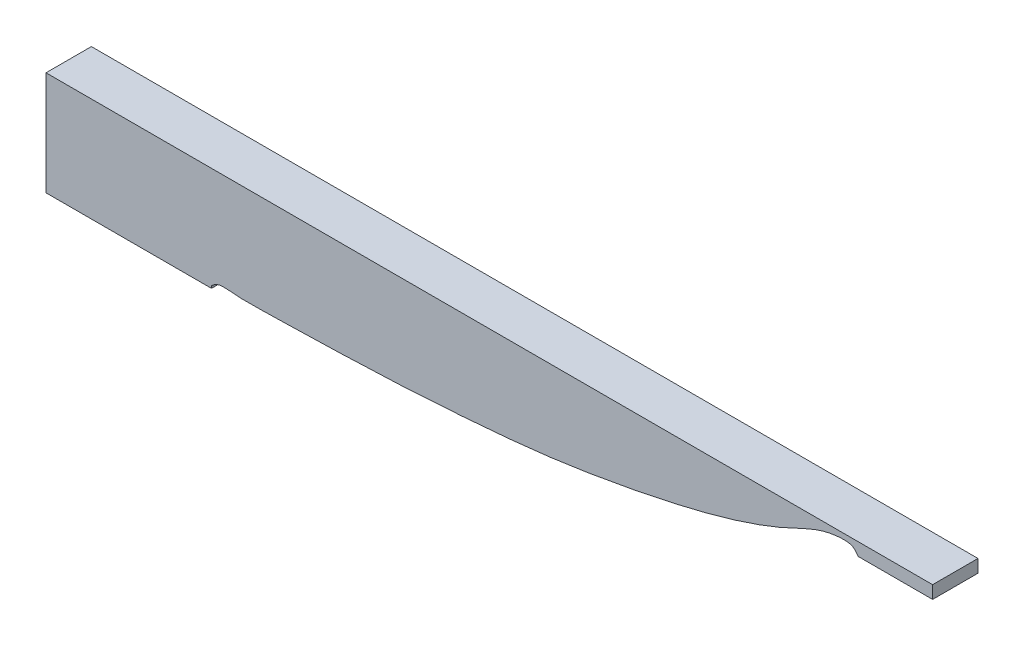
ISO-10303-21;
HEADER;
FILE_DESCRIPTION(('STEP AP214'),'2;1');
FILE_NAME('part.step','',(''),(''),'','','');
FILE_SCHEMA(('AUTOMOTIVE_DESIGN { 1 0 10303 214 1 1 1 1 }'));
ENDSEC;
DATA;
#1=APPLICATION_CONTEXT('core data for automotive mechanical design processes');
#2=APPLICATION_PROTOCOL_DEFINITION('international standard','automotive_design',2000,#1);
#3=PRODUCT_CONTEXT('',#1,'mechanical');
#4=PRODUCT('Part','Part','',(#3));
#5=PRODUCT_RELATED_PRODUCT_CATEGORY('part','',(#4));
#6=PRODUCT_DEFINITION_FORMATION('','',#4);
#7=PRODUCT_DEFINITION_CONTEXT('part definition',#1,'design');
#8=PRODUCT_DEFINITION('design','',#6,#7);
#9=PRODUCT_DEFINITION_SHAPE('','',#8);
#10=(LENGTH_UNIT() NAMED_UNIT(*) SI_UNIT(.MILLI.,.METRE.));
#11=(NAMED_UNIT(*) PLANE_ANGLE_UNIT() SI_UNIT($,.RADIAN.));
#12=(NAMED_UNIT(*) SI_UNIT($,.STERADIAN.) SOLID_ANGLE_UNIT());
#13=UNCERTAINTY_MEASURE_WITH_UNIT(LENGTH_MEASURE(1.E-05),#10,'distance_accuracy_value','');
#14=(GEOMETRIC_REPRESENTATION_CONTEXT(3) GLOBAL_UNCERTAINTY_ASSIGNED_CONTEXT((#13)) GLOBAL_UNIT_ASSIGNED_CONTEXT((#10,
#11,#12)) REPRESENTATION_CONTEXT('',''));
#15=CARTESIAN_POINT('',(0.,0.,0.));
#16=DIRECTION('',(0.,0.,1.));
#17=DIRECTION('',(1.,0.,0.));
#18=AXIS2_PLACEMENT_3D('',#15,#16,#17);
#19=CARTESIAN_POINT('',(-87.4894542831394,-16.0709596343908,428.));
#20=DIRECTION('',(-2.10516775839244E-06,0.999999999997784,0.));
#21=DIRECTION('',(-0.999999999997784,-2.10516775839244E-06,0.));
#22=AXIS2_PLACEMENT_3D('',#19,#20,#21);
#23=PLANE('',#22);
#24=DIRECTION('',(0.999999999997784,2.10516775839244E-06,0.));
#25=VECTOR('',#24,1.);
#26=CARTESIAN_POINT('',(-87.4894542831394,-16.0709596343908,420.));
#27=LINE('',#26,#25);
#28=CARTESIAN_POINT('',(-87.4894542831394,-16.0709596343908,420.));
#29=VERTEX_POINT('',#28);
#30=CARTESIAN_POINT('',(-58.3255403885278,-16.0708982394595,420.));
#31=VERTEX_POINT('',#30);
#32=EDGE_CURVE('E151',#29,#31,#27,.T.);
#33=ORIENTED_EDGE('',*,*,#32,.T.);
#34=DIRECTION('',(0.,0.,-1.));
#35=VECTOR('',#34,1.);
#36=CARTESIAN_POINT('',(-58.3255403885278,-16.0708982394595,428.));
#37=LINE('',#36,#35);
#38=CARTESIAN_POINT('',(-58.3255403885278,-16.0708982394595,428.));
#39=VERTEX_POINT('',#38);
#40=EDGE_CURVE('E11',#39,#31,#37,.T.);
#41=ORIENTED_EDGE('',*,*,#40,.F.);
#42=DIRECTION('',(0.999999999997784,2.10516775839244E-06,0.));
#43=VECTOR('',#42,1.);
#44=CARTESIAN_POINT('',(-87.4894542831394,-16.0709596343908,428.));
#45=LINE('',#44,#43);
#46=CARTESIAN_POINT('',(-87.4894542831394,-16.0709596343908,428.));
#47=VERTEX_POINT('',#46);
#48=EDGE_CURVE('E121',#47,#39,#45,.T.);
#49=ORIENTED_EDGE('',*,*,#48,.F.);
#50=DIRECTION('',(0.,0.,-1.));
#51=VECTOR('',#50,1.);
#52=CARTESIAN_POINT('',(-87.4894542831394,-16.0709596343908,428.));
#53=LINE('',#52,#51);
#54=EDGE_CURVE('E113',#47,#29,#53,.T.);
#55=ORIENTED_EDGE('',*,*,#54,.T.);
#56=EDGE_LOOP('',(#33,#41,#49,#55));
#57=FACE_BOUND('',#56,.T.);
#58=ADVANCED_FACE('F30',(#57),#23,.F.);
#59=CARTESIAN_POINT('',(-58.3255403885278,-16.0708982394595,428.));
#60=CARTESIAN_POINT('',(-58.3349945008703,-15.994079958224,428.));
#61=CARTESIAN_POINT('',(-58.3430996185986,-15.9155735939327,428.));
#62=CARTESIAN_POINT('',(-58.3263400943751,-15.7606406914637,428.));
#63=CARTESIAN_POINT('',(-58.3015582502265,-15.6843366767705,428.));
#64=CARTESIAN_POINT('',(-58.221198639925,-15.5517101154156,428.));
#65=CARTESIAN_POINT('',(-58.1629225494414,-15.4970308604943,428.));
#66=CARTESIAN_POINT('',(-58.0407921632544,-15.4050555278782,428.));
#67=CARTESIAN_POINT('',(-57.9775376150464,-15.3622181954311,428.));
#68=CARTESIAN_POINT('',(-57.7882476082578,-15.2330246652949,428.));
#69=CARTESIAN_POINT('',(-57.6573970115861,-15.1522569878723,428.));
#70=CARTESIAN_POINT('',(-57.3854637739449,-15.0116029227251,428.));
#71=CARTESIAN_POINT('',(-57.2447698982695,-14.9545835574969,428.));
#72=CARTESIAN_POINT('',(-56.9523823800674,-14.8715101929236,428.));
#73=CARTESIAN_POINT('',(-56.8002380245661,-14.8439752576486,428.));
#74=CARTESIAN_POINT('',(-56.497540480807,-14.8092799248791,428.));
#75=CARTESIAN_POINT('',(-56.345997900637,-14.8016448283076,428.));
#76=CARTESIAN_POINT('',(-55.8910348877392,-14.7955414848149,428.));
#77=CARTESIAN_POINT('',(-55.5872095119741,-14.8121250965454,428.));
#78=CARTESIAN_POINT('',(-54.9797376741491,-14.859540366615,428.));
#79=CARTESIAN_POINT('',(-54.6763438263725,-14.8904292500324,428.));
#80=CARTESIAN_POINT('',(-54.0689610457127,-14.93971413597,428.));
#81=CARTESIAN_POINT('',(-53.7650057217789,-14.9588157058092,428.));
#82=CARTESIAN_POINT('',(-52.8524586258942,-15.0018212807062,428.));
#83=CARTESIAN_POINT('',(-52.243148801839,-15.0106509051172,428.));
#84=CARTESIAN_POINT('',(-51.0233957443819,-15.0045159977491,428.));
#85=CARTESIAN_POINT('',(-50.413683374274,-14.9925929645954,428.));
#86=CARTESIAN_POINT('',(-49.1942847772398,-14.9684180581558,428.));
#87=CARTESIAN_POINT('',(-48.5845781267326,-14.9566852218082,428.));
#88=CARTESIAN_POINT('',(-46.7555324376674,-14.9179047275533,428.));
#89=CARTESIAN_POINT('',(-45.5362669172419,-14.887310986256,428.));
#90=CARTESIAN_POINT('',(-41.8784820456503,-14.7949659205474,428.));
#91=CARTESIAN_POINT('',(-39.4400289388297,-14.7303464901799,428.));
#92=CARTESIAN_POINT('',(-34.5635986833189,-14.5850149915789,428.));
#93=CARTESIAN_POINT('',(-32.1256708468318,-14.502897670421,428.));
#94=CARTESIAN_POINT('',(-27.2513382018958,-14.3006183262893,428.));
#95=CARTESIAN_POINT('',(-24.814964692482,-14.1802482106153,428.));
#96=CARTESIAN_POINT('',(-19.9450224759137,-13.8990207319383,428.));
#97=CARTESIAN_POINT('',(-17.5112758603808,-13.7386901222707,428.));
#98=CARTESIAN_POINT('',(-12.6458601928915,-13.3845758248458,428.));
#99=CARTESIAN_POINT('',(-10.2140363742769,-13.1925640461585,428.));
#100=CARTESIAN_POINT('',(-5.35587574845442,-12.7575885545654,428.));
#101=CARTESIAN_POINT('',(-2.92945374601444,-12.513373762498,428.));
#102=CARTESIAN_POINT('',(1.91495725909716,-11.9401575526273,428.));
#103=CARTESIAN_POINT('',(4.33273488245867,-11.6096528672461,428.));
#104=CARTESIAN_POINT('',(9.15239523998222,-10.8634908819737,428.));
#105=CARTESIAN_POINT('',(11.5555170791069,-10.4496694325095,428.));
#106=CARTESIAN_POINT('',(16.3519276015662,-9.56230873743193,428.));
#107=CARTESIAN_POINT('',(18.7451423542686,-9.08770435501141,428.));
#108=CARTESIAN_POINT('',(23.5146150195793,-8.06253442497621,428.));
#109=CARTESIAN_POINT('',(25.8923040265324,-7.5151610193815,428.));
#110=CARTESIAN_POINT('',(29.436552488622,-6.60817433943435,428.));
#111=CARTESIAN_POINT('',(30.6147750259266,-6.2904225308102,428.));
#112=CARTESIAN_POINT('',(32.9581752642637,-5.61669965307409,428.));
#113=CARTESIAN_POINT('',(34.1227795496316,-5.26042838224494,428.));
#114=CARTESIAN_POINT('',(36.4378473236999,-4.50920532821471,428.));
#115=CARTESIAN_POINT('',(37.5885132391884,-4.1148072600599,428.));
#116=CARTESIAN_POINT('',(39.8716268887461,-3.27617739738042,428.));
#117=CARTESIAN_POINT('',(41.0039178497968,-2.83151676841148,428.));
#118=CARTESIAN_POINT('',(42.6811785910618,-2.10660214801663,428.));
#119=CARTESIAN_POINT('',(43.2368433506352,-1.85560303459679,428.));
#120=CARTESIAN_POINT('',(44.3445395591243,-1.34366630703781,428.));
#121=CARTESIAN_POINT('',(44.8960191606172,-1.08119890956309,428.));
#122=CARTESIAN_POINT('',(46.5538033787544,-0.303092262715943,428.));
#123=CARTESIAN_POINT('',(47.6644508083302,0.200375035527951,428.));
#124=CARTESIAN_POINT('',(49.3991963594365,0.763156282351912,428.));
#125=CARTESIAN_POINT('',(49.9893332872162,0.917488174976652,428.));
#126=CARTESIAN_POINT('',(51.1943185326296,1.15701347600094,428.));
#127=CARTESIAN_POINT('',(51.8079485186502,1.24321360329939,428.));
#128=CARTESIAN_POINT('',(52.726500906872,1.30481067499705,428.));
#129=CARTESIAN_POINT('',(53.0332156410314,1.31450136830585,428.));
#130=CARTESIAN_POINT('',(53.4949732156863,1.2945987111883,428.));
#131=CARTESIAN_POINT('',(53.649161351078,1.28246925540658,428.));
#132=CARTESIAN_POINT('',(53.9582050323121,1.24457337626118,428.));
#133=CARTESIAN_POINT('',(54.1110774716984,1.21843119140016,428.));
#134=CARTESIAN_POINT('',(54.4102219996154,1.14057268930917,428.));
#135=CARTESIAN_POINT('',(54.558823927286,1.08721557390386,428.));
#136=CARTESIAN_POINT('',(54.8314730470977,0.939060799854606,428.));
#137=CARTESIAN_POINT('',(54.9521936399689,0.842183423002254,428.));
#138=CARTESIAN_POINT('',(55.1760288322301,0.624120594158259,428.));
#139=CARTESIAN_POINT('',(55.276054447828,0.504603795210752,428.));
#140=CARTESIAN_POINT('',(55.4317214651797,0.330291434711497,428.));
#141=CARTESIAN_POINT('',(55.4838226608845,0.272374406418086,428.));
#142=CARTESIAN_POINT('',(55.5765681192619,0.146438554929085,428.));
#143=CARTESIAN_POINT('',(55.6146311005568,0.0773729202210477,428.));
#144=CARTESIAN_POINT('',(55.6303665751122,0.,428.));
#145=B_SPLINE_CURVE_WITH_KNOTS('',3,(#59,#60,#61,#62,#63,#64,#65,#66,#67,#68,#69,#70,#71,#72,
#73,#74,#75,#76,#77,#78,#79,#80,#81,#82,#83,#84,#85,#86,#87,#88,#89,#90,#91,#92,#93,#94,#95,#96,
#97,#98,#99,#100,#101,#102,#103,#104,#105,#106,#107,#108,#109,#110,#111,#112,#113,#114,#115,
#116,#117,#118,#119,#120,#121,#122,#123,#124,#125,#126,#127,#128,#129,#130,#131,#132,#133,#134,
#135,#136,#137,#138,#139,#140,#141,#142,#143,#144),.UNSPECIFIED.,.F.,.F.,(4,2,2,2,2,2,2,2,2,2,2,
2,2,2,2,2,2,2,2,2,2,2,2,2,2,2,2,2,2,2,2,2,2,2,2,2,2,2,2,2,2,2,4),(0.,0.001953125,
0.00390624999999989,0.00585937499999989,0.00781249999999989,0.0117187499999998,
0.0156249999999997,0.0195312499999996,0.0234374999999996,0.0312499999999996,0.0390624999999997,
0.0468749999999998,0.0624999999999998,0.0781249999999998,0.0937499999999998,0.125,0.1875,
0.249999999999999,0.312499999999999,0.374999999999999,0.437499999999999,0.499999999999999,
0.562499999999999,0.624999999999999,0.687499999999999,0.749999999999999,0.781249999999999,
0.812499999999999,0.843749999999999,0.874999999999999,0.890624999999999,0.906249999999999,
0.9375,0.953125,0.96875,0.9765625,0.98046875,0.984375,0.98828125,0.9921875,0.99609375,
0.998046875,1.),.UNSPECIFIED.);
#146=DIRECTION('',(0.,0.,-1.));
#147=VECTOR('',#146,1.);
#148=SURFACE_OF_LINEAR_EXTRUSION('',#145,#147);
#149=CARTESIAN_POINT('',(-58.3255403885278,-16.0708982394595,420.000000000001));
#150=CARTESIAN_POINT('',(-58.3349945008703,-15.994079958224,420.000000000001));
#151=CARTESIAN_POINT('',(-58.3430996185986,-15.9155735939327,420.000000000001));
#152=CARTESIAN_POINT('',(-58.3263400943751,-15.7606406914637,420.000000000001));
#153=CARTESIAN_POINT('',(-58.3015582502265,-15.6843366767705,420.000000000001));
#154=CARTESIAN_POINT('',(-58.221198639925,-15.5517101154156,420.000000000001));
#155=CARTESIAN_POINT('',(-58.1629225494414,-15.4970308604943,420.000000000001));
#156=CARTESIAN_POINT('',(-58.0407921632544,-15.4050555278782,420.000000000001));
#157=CARTESIAN_POINT('',(-57.9775376150464,-15.3622181954311,420.000000000001));
#158=CARTESIAN_POINT('',(-57.7882476082578,-15.2330246652949,420.000000000001));
#159=CARTESIAN_POINT('',(-57.6573970115861,-15.1522569878723,420.000000000001));
#160=CARTESIAN_POINT('',(-57.3854637739449,-15.0116029227251,420.000000000001));
#161=CARTESIAN_POINT('',(-57.2447698982695,-14.9545835574969,420.000000000001));
#162=CARTESIAN_POINT('',(-56.9523823800674,-14.8715101929236,420.000000000001));
#163=CARTESIAN_POINT('',(-56.8002380245661,-14.8439752576486,420.000000000001));
#164=CARTESIAN_POINT('',(-56.497540480807,-14.8092799248791,420.000000000001));
#165=CARTESIAN_POINT('',(-56.345997900637,-14.8016448283076,420.000000000001));
#166=CARTESIAN_POINT('',(-55.8910348877392,-14.7955414848149,420.000000000001));
#167=CARTESIAN_POINT('',(-55.5872095119741,-14.8121250965454,420.000000000001));
#168=CARTESIAN_POINT('',(-54.9797376741491,-14.859540366615,420.000000000001));
#169=CARTESIAN_POINT('',(-54.6763438263725,-14.8904292500324,420.000000000001));
#170=CARTESIAN_POINT('',(-54.0689610457127,-14.93971413597,420.000000000001));
#171=CARTESIAN_POINT('',(-53.7650057217789,-14.9588157058092,420.000000000001));
#172=CARTESIAN_POINT('',(-52.8524586258942,-15.0018212807062,420.000000000001));
#173=CARTESIAN_POINT('',(-52.243148801839,-15.0106509051172,420.000000000001));
#174=CARTESIAN_POINT('',(-51.0233957443819,-15.0045159977491,420.000000000001));
#175=CARTESIAN_POINT('',(-50.413683374274,-14.9925929645954,420.000000000001));
#176=CARTESIAN_POINT('',(-49.1942847772398,-14.9684180581558,420.000000000001));
#177=CARTESIAN_POINT('',(-48.5845781267326,-14.9566852218082,420.000000000001));
#178=CARTESIAN_POINT('',(-46.7555324376674,-14.9179047275533,420.000000000001));
#179=CARTESIAN_POINT('',(-45.5362669172419,-14.887310986256,420.000000000001));
#180=CARTESIAN_POINT('',(-41.8784820456503,-14.7949659205474,420.000000000001));
#181=CARTESIAN_POINT('',(-39.4400289388297,-14.7303464901799,420.000000000001));
#182=CARTESIAN_POINT('',(-34.5635986833189,-14.5850149915789,420.000000000001));
#183=CARTESIAN_POINT('',(-32.1256708468318,-14.502897670421,420.000000000001));
#184=CARTESIAN_POINT('',(-27.2513382018958,-14.3006183262893,420.000000000001));
#185=CARTESIAN_POINT('',(-24.814964692482,-14.1802482106153,420.000000000001));
#186=CARTESIAN_POINT('',(-19.9450224759137,-13.8990207319383,420.000000000001));
#187=CARTESIAN_POINT('',(-17.5112758603808,-13.7386901222707,420.000000000001));
#188=CARTESIAN_POINT('',(-12.6458601928915,-13.3845758248458,420.000000000001));
#189=CARTESIAN_POINT('',(-10.2140363742769,-13.1925640461585,420.000000000001));
#190=CARTESIAN_POINT('',(-5.35587574845442,-12.7575885545654,420.000000000001));
#191=CARTESIAN_POINT('',(-2.92945374601444,-12.513373762498,420.000000000001));
#192=CARTESIAN_POINT('',(1.91495725909716,-11.9401575526273,420.000000000001));
#193=CARTESIAN_POINT('',(4.33273488245867,-11.6096528672461,420.000000000001));
#194=CARTESIAN_POINT('',(9.15239523998222,-10.8634908819737,420.000000000001));
#195=CARTESIAN_POINT('',(11.5555170791069,-10.4496694325095,420.000000000001));
#196=CARTESIAN_POINT('',(16.3519276015662,-9.56230873743193,420.000000000001));
#197=CARTESIAN_POINT('',(18.7451423542686,-9.08770435501141,420.000000000001));
#198=CARTESIAN_POINT('',(23.5146150195793,-8.06253442497621,420.000000000001));
#199=CARTESIAN_POINT('',(25.8923040265324,-7.5151610193815,420.000000000001));
#200=CARTESIAN_POINT('',(29.436552488622,-6.60817433943435,420.000000000001));
#201=CARTESIAN_POINT('',(30.6147750259266,-6.2904225308102,420.000000000001));
#202=CARTESIAN_POINT('',(32.9581752642637,-5.61669965307409,420.000000000001));
#203=CARTESIAN_POINT('',(34.1227795496316,-5.26042838224494,420.000000000001));
#204=CARTESIAN_POINT('',(36.4378473236999,-4.50920532821471,420.000000000001));
#205=CARTESIAN_POINT('',(37.5885132391884,-4.1148072600599,420.000000000001));
#206=CARTESIAN_POINT('',(39.8716268887461,-3.27617739738042,420.000000000001));
#207=CARTESIAN_POINT('',(41.0039178497968,-2.83151676841148,420.000000000001));
#208=CARTESIAN_POINT('',(42.6811785910618,-2.10660214801663,420.000000000001));
#209=CARTESIAN_POINT('',(43.2368433506352,-1.85560303459679,420.000000000001));
#210=CARTESIAN_POINT('',(44.3445395591243,-1.34366630703781,420.000000000001));
#211=CARTESIAN_POINT('',(44.8960191606172,-1.08119890956309,420.000000000001));
#212=CARTESIAN_POINT('',(46.5538033787544,-0.303092262715943,420.000000000001));
#213=CARTESIAN_POINT('',(47.6644508083302,0.200375035527951,420.000000000001));
#214=CARTESIAN_POINT('',(49.3991963594365,0.763156282351912,420.000000000001));
#215=CARTESIAN_POINT('',(49.9893332872162,0.917488174976652,420.000000000001));
#216=CARTESIAN_POINT('',(51.1943185326296,1.15701347600094,420.000000000001));
#217=CARTESIAN_POINT('',(51.8079485186502,1.24321360329939,420.000000000001));
#218=CARTESIAN_POINT('',(52.726500906872,1.30481067499705,420.000000000001));
#219=CARTESIAN_POINT('',(53.0332156410314,1.31450136830585,420.000000000001));
#220=CARTESIAN_POINT('',(53.4949732156863,1.2945987111883,420.000000000001));
#221=CARTESIAN_POINT('',(53.649161351078,1.28246925540658,420.000000000001));
#222=CARTESIAN_POINT('',(53.9582050323121,1.24457337626118,420.000000000001));
#223=CARTESIAN_POINT('',(54.1110774716984,1.21843119140016,420.000000000001));
#224=CARTESIAN_POINT('',(54.4102219996154,1.14057268930917,420.000000000001));
#225=CARTESIAN_POINT('',(54.558823927286,1.08721557390386,420.000000000001));
#226=CARTESIAN_POINT('',(54.8314730470977,0.939060799854606,420.000000000001));
#227=CARTESIAN_POINT('',(54.9521936399689,0.842183423002254,420.000000000001));
#228=CARTESIAN_POINT('',(55.1760288322301,0.624120594158259,420.000000000001));
#229=CARTESIAN_POINT('',(55.276054447828,0.504603795210752,420.000000000001));
#230=CARTESIAN_POINT('',(55.4317214651797,0.330291434711497,420.000000000001));
#231=CARTESIAN_POINT('',(55.4838226608845,0.272374406418086,420.000000000001));
#232=CARTESIAN_POINT('',(55.5765681192619,0.146438554929085,420.000000000001));
#233=CARTESIAN_POINT('',(55.6146311005568,0.0773729202210477,420.000000000001));
#234=CARTESIAN_POINT('',(55.6303665751122,0.,420.000000000001));
#235=B_SPLINE_CURVE_WITH_KNOTS('',3,(#149,#150,#151,#152,#153,#154,#155,#156,#157,#158,#159,
#160,#161,#162,#163,#164,#165,#166,#167,#168,#169,#170,#171,#172,#173,#174,#175,#176,#177,#178,
#179,#180,#181,#182,#183,#184,#185,#186,#187,#188,#189,#190,#191,#192,#193,#194,#195,#196,#197,
#198,#199,#200,#201,#202,#203,#204,#205,#206,#207,#208,#209,#210,#211,#212,#213,#214,#215,#216,
#217,#218,#219,#220,#221,#222,#223,#224,#225,#226,#227,#228,#229,#230,#231,#232,#233,#234),
.UNSPECIFIED.,.F.,.F.,(4,2,2,2,2,2,2,2,2,2,2,2,2,2,2,2,2,2,2,2,2,2,2,2,2,2,2,2,2,2,2,2,2,2,2,2,
2,2,2,2,2,2,4),(0.,0.001953125,0.00390624999999989,0.00585937499999989,0.00781249999999989,
0.0117187499999998,0.0156249999999997,0.0195312499999996,0.0234374999999996,0.0312499999999996,
0.0390624999999997,0.0468749999999998,0.0624999999999998,0.0781249999999998,0.0937499999999998,
0.125,0.1875,0.249999999999999,0.312499999999999,0.374999999999999,0.437499999999999,
0.499999999999999,0.562499999999999,0.624999999999999,0.687499999999999,0.749999999999999,
0.781249999999999,0.812499999999999,0.843749999999999,0.874999999999999,0.890624999999999,
0.906249999999999,0.9375,0.953125,0.96875,0.9765625,0.98046875,0.984375,0.98828125,0.9921875,
0.99609375,0.998046875,1.),.UNSPECIFIED.);
#236=CARTESIAN_POINT('',(55.6303665751122,0.,420.));
#237=VERTEX_POINT('',#236);
#238=EDGE_CURVE('E159',#31,#237,#235,.T.);
#239=ORIENTED_EDGE('',*,*,#238,.T.);
#240=DIRECTION('',(0.,0.,-1.));
#241=VECTOR('',#240,1.);
#242=CARTESIAN_POINT('',(55.6303665751122,0.,428.));
#243=LINE('',#242,#241);
#244=CARTESIAN_POINT('',(55.6303665751122,0.,428.));
#245=VERTEX_POINT('',#244);
#246=EDGE_CURVE('E39',#245,#237,#243,.T.);
#247=ORIENTED_EDGE('',*,*,#246,.F.);
#248=CARTESIAN_POINT('',(55.6303665751122,0.,428.));
#249=CARTESIAN_POINT('',(55.6146311005568,0.0773729202210477,428.));
#250=CARTESIAN_POINT('',(55.5765681192619,0.146438554929085,428.));
#251=CARTESIAN_POINT('',(55.4838226608845,0.272374406418086,428.));
#252=CARTESIAN_POINT('',(55.4317214651797,0.330291434711497,428.));
#253=CARTESIAN_POINT('',(55.276054447828,0.504603795210752,428.));
#254=CARTESIAN_POINT('',(55.1760288322301,0.624120594158259,428.));
#255=CARTESIAN_POINT('',(54.9521936399689,0.842183423002254,428.));
#256=CARTESIAN_POINT('',(54.8314730470977,0.939060799854606,428.));
#257=CARTESIAN_POINT('',(54.558823927286,1.08721557390386,428.));
#258=CARTESIAN_POINT('',(54.4102219996154,1.14057268930917,428.));
#259=CARTESIAN_POINT('',(54.1110774716984,1.21843119140016,428.));
#260=CARTESIAN_POINT('',(53.9582050323121,1.24457337626118,428.));
#261=CARTESIAN_POINT('',(53.649161351078,1.28246925540658,428.));
#262=CARTESIAN_POINT('',(53.4949732156863,1.2945987111883,428.));
#263=CARTESIAN_POINT('',(53.0332156410314,1.31450136830585,428.));
#264=CARTESIAN_POINT('',(52.726500906872,1.30481067499705,428.));
#265=CARTESIAN_POINT('',(51.8079485186502,1.24321360329939,428.));
#266=CARTESIAN_POINT('',(51.1943185326296,1.15701347600094,428.));
#267=CARTESIAN_POINT('',(49.9893332872162,0.917488174976652,428.));
#268=CARTESIAN_POINT('',(49.3991963594365,0.763156282351912,428.));
#269=CARTESIAN_POINT('',(47.6644508083302,0.200375035527951,428.));
#270=CARTESIAN_POINT('',(46.5538033787544,-0.303092262715943,428.));
#271=CARTESIAN_POINT('',(44.8960191606172,-1.08119890956309,428.));
#272=CARTESIAN_POINT('',(44.3445395591243,-1.34366630703781,428.));
#273=CARTESIAN_POINT('',(43.2368433506352,-1.85560303459679,428.));
#274=CARTESIAN_POINT('',(42.6811785910618,-2.10660214801663,428.));
#275=CARTESIAN_POINT('',(41.0039178497968,-2.83151676841148,428.));
#276=CARTESIAN_POINT('',(39.8716268887461,-3.27617739738042,428.));
#277=CARTESIAN_POINT('',(37.5885132391884,-4.1148072600599,428.));
#278=CARTESIAN_POINT('',(36.4378473236999,-4.50920532821471,428.));
#279=CARTESIAN_POINT('',(34.1227795496316,-5.26042838224494,428.));
#280=CARTESIAN_POINT('',(32.9581752642637,-5.61669965307409,428.));
#281=CARTESIAN_POINT('',(30.6147750259266,-6.2904225308102,428.));
#282=CARTESIAN_POINT('',(29.436552488622,-6.60817433943435,428.));
#283=CARTESIAN_POINT('',(25.8923040265324,-7.5151610193815,428.));
#284=CARTESIAN_POINT('',(23.5146150195793,-8.06253442497621,428.));
#285=CARTESIAN_POINT('',(18.7451423542686,-9.08770435501141,428.));
#286=CARTESIAN_POINT('',(16.3519276015662,-9.56230873743193,428.));
#287=CARTESIAN_POINT('',(11.5555170791069,-10.4496694325095,428.));
#288=CARTESIAN_POINT('',(9.15239523998222,-10.8634908819737,428.));
#289=CARTESIAN_POINT('',(4.33273488245867,-11.6096528672461,428.));
#290=CARTESIAN_POINT('',(1.91495725909716,-11.9401575526273,428.));
#291=CARTESIAN_POINT('',(-2.92945374601444,-12.513373762498,428.));
#292=CARTESIAN_POINT('',(-5.35587574845442,-12.7575885545654,428.));
#293=CARTESIAN_POINT('',(-10.2140363742769,-13.1925640461585,428.));
#294=CARTESIAN_POINT('',(-12.6458601928915,-13.3845758248458,428.));
#295=CARTESIAN_POINT('',(-17.5112758603808,-13.7386901222707,428.));
#296=CARTESIAN_POINT('',(-19.9450224759137,-13.8990207319383,428.));
#297=CARTESIAN_POINT('',(-24.814964692482,-14.1802482106153,428.));
#298=CARTESIAN_POINT('',(-27.2513382018958,-14.3006183262893,428.));
#299=CARTESIAN_POINT('',(-32.1256708468318,-14.502897670421,428.));
#300=CARTESIAN_POINT('',(-34.5635986833189,-14.5850149915789,428.));
#301=CARTESIAN_POINT('',(-39.4400289388297,-14.7303464901799,428.));
#302=CARTESIAN_POINT('',(-41.8784820456503,-14.7949659205474,428.));
#303=CARTESIAN_POINT('',(-45.5362669172419,-14.887310986256,428.));
#304=CARTESIAN_POINT('',(-46.7555324376674,-14.9179047275533,428.));
#305=CARTESIAN_POINT('',(-48.5845781267326,-14.9566852218082,428.));
#306=CARTESIAN_POINT('',(-49.1942847772398,-14.9684180581558,428.));
#307=CARTESIAN_POINT('',(-50.413683374274,-14.9925929645954,428.));
#308=CARTESIAN_POINT('',(-51.0233957443819,-15.0045159977491,428.));
#309=CARTESIAN_POINT('',(-52.243148801839,-15.0106509051172,428.));
#310=CARTESIAN_POINT('',(-52.8524586258942,-15.0018212807062,428.));
#311=CARTESIAN_POINT('',(-53.7650057217789,-14.9588157058092,428.));
#312=CARTESIAN_POINT('',(-54.0689610457127,-14.93971413597,428.));
#313=CARTESIAN_POINT('',(-54.6763438263725,-14.8904292500324,428.));
#314=CARTESIAN_POINT('',(-54.9797376741491,-14.859540366615,428.));
#315=CARTESIAN_POINT('',(-55.5872095119741,-14.8121250965454,428.));
#316=CARTESIAN_POINT('',(-55.8910348877392,-14.7955414848149,428.));
#317=CARTESIAN_POINT('',(-56.345997900637,-14.8016448283076,428.));
#318=CARTESIAN_POINT('',(-56.497540480807,-14.8092799248791,428.));
#319=CARTESIAN_POINT('',(-56.8002380245661,-14.8439752576486,428.));
#320=CARTESIAN_POINT('',(-56.9523823800674,-14.8715101929236,428.));
#321=CARTESIAN_POINT('',(-57.2447698982695,-14.9545835574969,428.));
#322=CARTESIAN_POINT('',(-57.3854637739449,-15.0116029227251,428.));
#323=CARTESIAN_POINT('',(-57.6573970115861,-15.1522569878723,428.));
#324=CARTESIAN_POINT('',(-57.7882476082578,-15.2330246652949,428.));
#325=CARTESIAN_POINT('',(-57.9775376150464,-15.3622181954311,428.));
#326=CARTESIAN_POINT('',(-58.0407921632544,-15.4050555278782,428.));
#327=CARTESIAN_POINT('',(-58.1629225494414,-15.4970308604943,428.));
#328=CARTESIAN_POINT('',(-58.221198639925,-15.5517101154156,428.));
#329=CARTESIAN_POINT('',(-58.3015582502265,-15.6843366767705,428.));
#330=CARTESIAN_POINT('',(-58.3263400943751,-15.7606406914637,428.));
#331=CARTESIAN_POINT('',(-58.3430996185986,-15.9155735939327,428.));
#332=CARTESIAN_POINT('',(-58.3349945008703,-15.994079958224,428.));
#333=CARTESIAN_POINT('',(-58.3255403885278,-16.0708982394595,428.));
#334=B_SPLINE_CURVE_WITH_KNOTS('',3,(#248,#249,#250,#251,#252,#253,#254,#255,#256,#257,#258,
#259,#260,#261,#262,#263,#264,#265,#266,#267,#268,#269,#270,#271,#272,#273,#274,#275,#276,#277,
#278,#279,#280,#281,#282,#283,#284,#285,#286,#287,#288,#289,#290,#291,#292,#293,#294,#295,#296,
#297,#298,#299,#300,#301,#302,#303,#304,#305,#306,#307,#308,#309,#310,#311,#312,#313,#314,#315,
#316,#317,#318,#319,#320,#321,#322,#323,#324,#325,#326,#327,#328,#329,#330,#331,#332,#333),
.UNSPECIFIED.,.F.,.F.,(4,2,2,2,2,2,2,2,2,2,2,2,2,2,2,2,2,2,2,2,2,2,2,2,2,2,2,2,2,2,2,2,2,2,2,2,
2,2,2,2,2,2,4),(0.,0.001953125,0.00390624999999989,0.0078125,0.01171875,0.015625,
0.0195312500000001,0.0234375000000001,0.0312500000000002,0.0468750000000003,0.0625000000000004,
0.0937500000000006,0.109375000000001,0.125000000000001,0.156250000000001,0.187500000000001,
0.218750000000001,0.250000000000001,0.312500000000001,0.375000000000001,0.437500000000001,
0.500000000000001,0.562500000000001,0.625000000000001,0.687500000000001,0.750000000000001,
0.8125,0.875,0.90625,0.921875,0.9375,0.953125,0.9609375,0.96875,0.9765625,0.98046875,0.984375,
0.98828125,0.9921875,0.994140625,0.99609375,0.998046875,1.),.UNSPECIFIED.);
#335=EDGE_CURVE('E85',#39,#245,#334,.F.);
#336=ORIENTED_EDGE('',*,*,#335,.F.);
#337=ORIENTED_EDGE('',*,*,#40,.T.);
#338=EDGE_LOOP('',(#239,#247,#336,#337));
#339=FACE_BOUND('',#338,.T.);
#340=ADVANCED_FACE('F165',(#339),#148,.F.);
#341=CARTESIAN_POINT('',(55.6303665751122,0.,428.));
#342=DIRECTION('',(0.,1.,0.));
#343=DIRECTION('',(-1.,0.,0.));
#344=AXIS2_PLACEMENT_3D('',#341,#342,#343);
#345=PLANE('',#344);
#346=DIRECTION('',(1.,0.,0.));
#347=VECTOR('',#346,1.);
#348=CARTESIAN_POINT('',(55.6303665751122,0.,420.));
#349=LINE('',#348,#347);
#350=CARTESIAN_POINT('',(68.7738298885125,0.,420.));
#351=VERTEX_POINT('',#350);
#352=EDGE_CURVE('E118',#237,#351,#349,.T.);
#353=ORIENTED_EDGE('',*,*,#352,.T.);
#354=DIRECTION('',(0.,0.,-1.));
#355=VECTOR('',#354,1.);
#356=CARTESIAN_POINT('',(68.7738298885125,0.,428.));
#357=LINE('',#356,#355);
#358=CARTESIAN_POINT('',(68.7738298885125,0.,428.));
#359=VERTEX_POINT('',#358);
#360=EDGE_CURVE('E108',#359,#351,#357,.T.);
#361=ORIENTED_EDGE('',*,*,#360,.F.);
#362=DIRECTION('',(1.,0.,0.));
#363=VECTOR('',#362,1.);
#364=CARTESIAN_POINT('',(55.6303665751122,0.,428.));
#365=LINE('',#364,#363);
#366=EDGE_CURVE('E99',#245,#359,#365,.T.);
#367=ORIENTED_EDGE('',*,*,#366,.F.);
#368=ORIENTED_EDGE('',*,*,#246,.T.);
#369=EDGE_LOOP('',(#353,#361,#367,#368));
#370=FACE_BOUND('',#369,.T.);
#371=ADVANCED_FACE('F169',(#370),#345,.F.);
#372=CARTESIAN_POINT('',(68.7738298885125,2.25600000000005,428.));
#373=DIRECTION('',(-1.,0.,0.));
#374=DIRECTION('',(0.,0.,1.));
#375=AXIS2_PLACEMENT_3D('',#372,#373,#374);
#376=PLANE('',#375);
#377=DIRECTION('',(0.,1.,0.));
#378=VECTOR('',#377,1.);
#379=CARTESIAN_POINT('',(68.7738298885125,2.25600000000005,420.));
#380=LINE('',#379,#378);
#381=CARTESIAN_POINT('',(68.7738298885125,2.25600000000005,420.));
#382=VERTEX_POINT('',#381);
#383=EDGE_CURVE('E107',#351,#382,#380,.T.);
#384=ORIENTED_EDGE('',*,*,#383,.T.);
#385=DIRECTION('',(0.,0.,-1.));
#386=VECTOR('',#385,1.);
#387=CARTESIAN_POINT('',(68.7738298885125,2.25600000000005,428.));
#388=LINE('',#387,#386);
#389=CARTESIAN_POINT('',(68.7738298885125,2.25600000000005,428.));
#390=VERTEX_POINT('',#389);
#391=EDGE_CURVE('E104',#390,#382,#388,.T.);
#392=ORIENTED_EDGE('',*,*,#391,.F.);
#393=DIRECTION('',(0.,1.,0.));
#394=VECTOR('',#393,1.);
#395=CARTESIAN_POINT('',(68.7738298885125,2.25600000000005,428.));
#396=LINE('',#395,#394);
#397=EDGE_CURVE('E93',#359,#390,#396,.T.);
#398=ORIENTED_EDGE('',*,*,#397,.F.);
#399=ORIENTED_EDGE('',*,*,#360,.T.);
#400=EDGE_LOOP('',(#384,#392,#398,#399));
#401=FACE_BOUND('',#400,.T.);
#402=ADVANCED_FACE('F105',(#401),#376,.F.);
#403=CARTESIAN_POINT('',(68.7738298885125,2.25600000000005,428.));
#404=DIRECTION('',(0.,-1.,0.));
#405=DIRECTION('',(1.,0.,0.));
#406=AXIS2_PLACEMENT_3D('',#403,#404,#405);
#407=PLANE('',#406);
#408=DIRECTION('',(-1.,0.,0.));
#409=VECTOR('',#408,1.);
#410=CARTESIAN_POINT('',(68.7738298885125,2.25600000000005,420.));
#411=LINE('',#410,#409);
#412=CARTESIAN_POINT('',(-87.4894542831394,2.25600000000003,420.));
#413=VERTEX_POINT('',#412);
#414=EDGE_CURVE('E71',#382,#413,#411,.T.);
#415=ORIENTED_EDGE('',*,*,#414,.T.);
#416=DIRECTION('',(0.,0.,-1.));
#417=VECTOR('',#416,1.);
#418=CARTESIAN_POINT('',(-87.4894542831394,2.25600000000003,428.));
#419=LINE('',#418,#417);
#420=CARTESIAN_POINT('',(-87.4894542831394,2.25600000000003,428.));
#421=VERTEX_POINT('',#420);
#422=EDGE_CURVE('E109',#421,#413,#419,.T.);
#423=ORIENTED_EDGE('',*,*,#422,.F.);
#424=DIRECTION('',(-1.,0.,0.));
#425=VECTOR('',#424,1.);
#426=CARTESIAN_POINT('',(68.7738298885125,2.25600000000005,428.));
#427=LINE('',#426,#425);
#428=EDGE_CURVE('E97',#390,#421,#427,.T.);
#429=ORIENTED_EDGE('',*,*,#428,.F.);
#430=ORIENTED_EDGE('',*,*,#391,.T.);
#431=EDGE_LOOP('',(#415,#423,#429,#430));
#432=FACE_BOUND('',#431,.T.);
#433=ADVANCED_FACE('F111',(#432),#407,.F.);
#434=CARTESIAN_POINT('',(-87.4894542831394,-16.0709596343908,428.));
#435=DIRECTION('',(1.,0.,0.));
#436=DIRECTION('',(0.,0.,-1.));
#437=AXIS2_PLACEMENT_3D('',#434,#435,#436);
#438=PLANE('',#437);
#439=DIRECTION('',(0.,-1.,0.));
#440=VECTOR('',#439,1.);
#441=CARTESIAN_POINT('',(-87.4894542831394,-16.0709596343908,420.));
#442=LINE('',#441,#440);
#443=EDGE_CURVE('E77',#413,#29,#442,.T.);
#444=ORIENTED_EDGE('',*,*,#443,.T.);
#445=ORIENTED_EDGE('',*,*,#54,.F.);
#446=DIRECTION('',(0.,-1.,0.));
#447=VECTOR('',#446,1.);
#448=CARTESIAN_POINT('',(-87.4894542831394,-16.0709596343908,428.));
#449=LINE('',#448,#447);
#450=EDGE_CURVE('E48',#421,#47,#449,.T.);
#451=ORIENTED_EDGE('',*,*,#450,.F.);
#452=ORIENTED_EDGE('',*,*,#422,.T.);
#453=EDGE_LOOP('',(#444,#445,#451,#452));
#454=FACE_BOUND('',#453,.T.);
#455=ADVANCED_FACE('F139',(#454),#438,.F.);
#456=CARTESIAN_POINT('',(-0.507248243458519,-12.2267656575626,428.));
#457=DIRECTION('',(0.,0.,-1.));
#458=DIRECTION('',(-1.,0.,0.));
#459=AXIS2_PLACEMENT_3D('',#456,#457,#458);
#460=PLANE('',#459);
#461=ORIENTED_EDGE('',*,*,#48,.T.);
#462=ORIENTED_EDGE('',*,*,#335,.T.);
#463=ORIENTED_EDGE('',*,*,#366,.T.);
#464=ORIENTED_EDGE('',*,*,#397,.T.);
#465=ORIENTED_EDGE('',*,*,#428,.T.);
#466=ORIENTED_EDGE('',*,*,#450,.T.);
#467=EDGE_LOOP('',(#461,#462,#463,#464,#465,#466));
#468=FACE_BOUND('',#467,.T.);
#469=ADVANCED_FACE('F95',(#468),#460,.F.);
#470=CARTESIAN_POINT('',(-0.507248243458519,-12.2267656575626,420.));
#471=DIRECTION('',(0.,0.,-1.));
#472=DIRECTION('',(-1.,0.,0.));
#473=AXIS2_PLACEMENT_3D('',#470,#471,#472);
#474=PLANE('',#473);
#475=ORIENTED_EDGE('',*,*,#32,.F.);
#476=ORIENTED_EDGE('',*,*,#443,.F.);
#477=ORIENTED_EDGE('',*,*,#414,.F.);
#478=ORIENTED_EDGE('',*,*,#383,.F.);
#479=ORIENTED_EDGE('',*,*,#352,.F.);
#480=ORIENTED_EDGE('',*,*,#238,.F.);
#481=EDGE_LOOP('',(#475,#476,#477,#478,#479,#480));
#482=FACE_BOUND('',#481,.T.);
#483=ADVANCED_FACE('F138',(#482),#474,.T.);
#484=CLOSED_SHELL('',(#58,#340,#371,#402,#433,#455,#469,#483));
#485=MANIFOLD_SOLID_BREP('B2',#484);
#486=ADVANCED_BREP_SHAPE_REPRESENTATION('',(#18,#485),#14);
#487=SHAPE_DEFINITION_REPRESENTATION(#9,#486);
ENDSEC;
END-ISO-10303-21;
